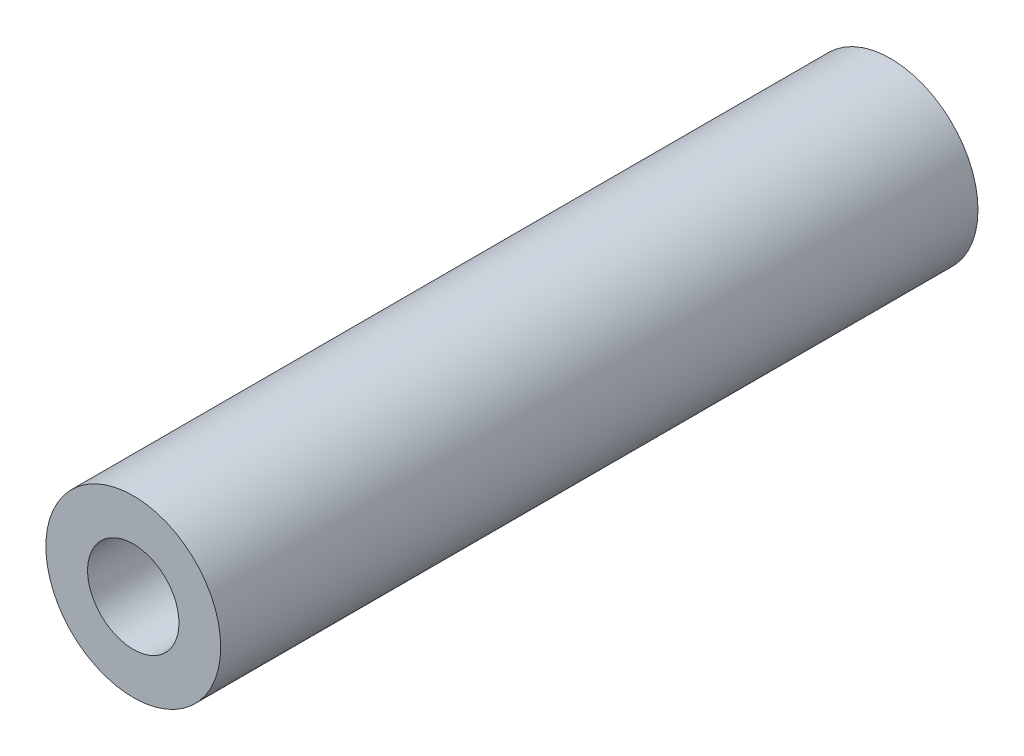
ISO-10303-21;
HEADER;
FILE_DESCRIPTION(('STEP AP214'),'2;1');
FILE_NAME('part.step','',(''),(''),'','','');
FILE_SCHEMA(('AUTOMOTIVE_DESIGN { 1 0 10303 214 1 1 1 1 }'));
ENDSEC;
DATA;
#1=APPLICATION_CONTEXT('core data for automotive mechanical design processes');
#2=APPLICATION_PROTOCOL_DEFINITION('international standard','automotive_design',2000,#1);
#3=PRODUCT_CONTEXT('',#1,'mechanical');
#4=PRODUCT('Part','Part','',(#3));
#5=PRODUCT_RELATED_PRODUCT_CATEGORY('part','',(#4));
#6=PRODUCT_DEFINITION_FORMATION('','',#4);
#7=PRODUCT_DEFINITION_CONTEXT('part definition',#1,'design');
#8=PRODUCT_DEFINITION('design','',#6,#7);
#9=PRODUCT_DEFINITION_SHAPE('','',#8);
#10=(LENGTH_UNIT() NAMED_UNIT(*) SI_UNIT(.MILLI.,.METRE.));
#11=(NAMED_UNIT(*) PLANE_ANGLE_UNIT() SI_UNIT($,.RADIAN.));
#12=(NAMED_UNIT(*) SI_UNIT($,.STERADIAN.) SOLID_ANGLE_UNIT());
#13=UNCERTAINTY_MEASURE_WITH_UNIT(LENGTH_MEASURE(1.E-05),#10,'distance_accuracy_value','');
#14=(GEOMETRIC_REPRESENTATION_CONTEXT(3) GLOBAL_UNCERTAINTY_ASSIGNED_CONTEXT((#13)) GLOBAL_UNIT_ASSIGNED_CONTEXT((#10,
#11,#12)) REPRESENTATION_CONTEXT('',''));
#15=CARTESIAN_POINT('',(0.,0.,0.));
#16=DIRECTION('',(0.,0.,1.));
#17=DIRECTION('',(1.,0.,0.));
#18=AXIS2_PLACEMENT_3D('',#15,#16,#17);
#19=CARTESIAN_POINT('',(0.,0.,20.6248));
#20=DIRECTION('',(0.,0.,1.));
#21=DIRECTION('',(1.,0.,0.));
#22=AXIS2_PLACEMENT_3D('',#19,#20,#21);
#23=PLANE('',#22);
#24=CARTESIAN_POINT('',(0.,0.,20.6248));
#25=DIRECTION('',(0.,0.,1.));
#26=DIRECTION('',(1.,0.,0.));
#27=AXIS2_PLACEMENT_3D('',#24,#25,#26);
#28=CIRCLE('',#27,4.7625);
#29=CARTESIAN_POINT('',(4.7625,0.,20.6248));
#30=VERTEX_POINT('',#29);
#31=EDGE_CURVE('E10',#30,#30,#28,.T.);
#32=ORIENTED_EDGE('',*,*,#31,.T.);
#33=EDGE_LOOP('',(#32));
#34=FACE_BOUND('',#33,.T.);
#35=CARTESIAN_POINT('',(0.,0.,20.6248));
#36=DIRECTION('',(0.,0.,1.));
#37=DIRECTION('',(1.,0.,0.));
#38=AXIS2_PLACEMENT_3D('',#35,#36,#37);
#39=CIRCLE('',#38,2.4892);
#40=CARTESIAN_POINT('',(2.4892,0.,20.6248));
#41=VERTEX_POINT('',#40);
#42=EDGE_CURVE('E56',#41,#41,#39,.T.);
#43=ORIENTED_EDGE('',*,*,#42,.F.);
#44=EDGE_LOOP('',(#43));
#45=FACE_BOUND('',#44,.T.);
#46=ADVANCED_FACE('F43',(#34,#45),#23,.T.);
#47=CARTESIAN_POINT('',(0.,0.,-20.6248));
#48=DIRECTION('',(0.,0.,1.));
#49=DIRECTION('',(1.,0.,0.));
#50=AXIS2_PLACEMENT_3D('',#47,#48,#49);
#51=PLANE('',#50);
#52=CARTESIAN_POINT('',(0.,0.,-20.6248));
#53=DIRECTION('',(0.,0.,1.));
#54=DIRECTION('',(1.,0.,0.));
#55=AXIS2_PLACEMENT_3D('',#52,#53,#54);
#56=CIRCLE('',#55,4.7625);
#57=CARTESIAN_POINT('',(4.7625,0.,-20.6248));
#58=VERTEX_POINT('',#57);
#59=EDGE_CURVE('E47',#58,#58,#56,.T.);
#60=ORIENTED_EDGE('',*,*,#59,.F.);
#61=EDGE_LOOP('',(#60));
#62=FACE_BOUND('',#61,.T.);
#63=CARTESIAN_POINT('',(0.,0.,-20.6248));
#64=DIRECTION('',(0.,0.,1.));
#65=DIRECTION('',(1.,0.,0.));
#66=AXIS2_PLACEMENT_3D('',#63,#64,#65);
#67=CIRCLE('',#66,2.4892);
#68=CARTESIAN_POINT('',(2.4892,0.,-20.6248));
#69=VERTEX_POINT('',#68);
#70=EDGE_CURVE('E58',#69,#69,#67,.T.);
#71=ORIENTED_EDGE('',*,*,#70,.T.);
#72=EDGE_LOOP('',(#71));
#73=FACE_BOUND('',#72,.T.);
#74=ADVANCED_FACE('F70',(#62,#73),#51,.F.);
#75=CARTESIAN_POINT('',(0.,0.,20.6248));
#76=DIRECTION('',(0.,0.,-1.));
#77=DIRECTION('',(-1.,0.,0.));
#78=AXIS2_PLACEMENT_3D('',#75,#76,#77);
#79=CYLINDRICAL_SURFACE('',#78,4.7625);
#80=ORIENTED_EDGE('',*,*,#31,.F.);
#81=EDGE_LOOP('',(#80));
#82=FACE_BOUND('',#81,.T.);
#83=ORIENTED_EDGE('',*,*,#59,.T.);
#84=EDGE_LOOP('',(#83));
#85=FACE_BOUND('',#84,.T.);
#86=ADVANCED_FACE('F45',(#82,#85),#79,.T.);
#87=CARTESIAN_POINT('',(0.,0.,20.6248));
#88=DIRECTION('',(0.,0.,-1.));
#89=DIRECTION('',(-1.,0.,0.));
#90=AXIS2_PLACEMENT_3D('',#87,#88,#89);
#91=CYLINDRICAL_SURFACE('',#90,2.4892);
#92=ORIENTED_EDGE('',*,*,#42,.T.);
#93=EDGE_LOOP('',(#92));
#94=FACE_BOUND('',#93,.T.);
#95=ORIENTED_EDGE('',*,*,#70,.F.);
#96=EDGE_LOOP('',(#95));
#97=FACE_BOUND('',#96,.T.);
#98=ADVANCED_FACE('F66',(#94,#97),#91,.F.);
#99=CLOSED_SHELL('',(#46,#74,#86,#98));
#100=MANIFOLD_SOLID_BREP('B2',#99);
#101=ADVANCED_BREP_SHAPE_REPRESENTATION('',(#18,#100),#14);
#102=SHAPE_DEFINITION_REPRESENTATION(#9,#101);
ENDSEC;
END-ISO-10303-21;
